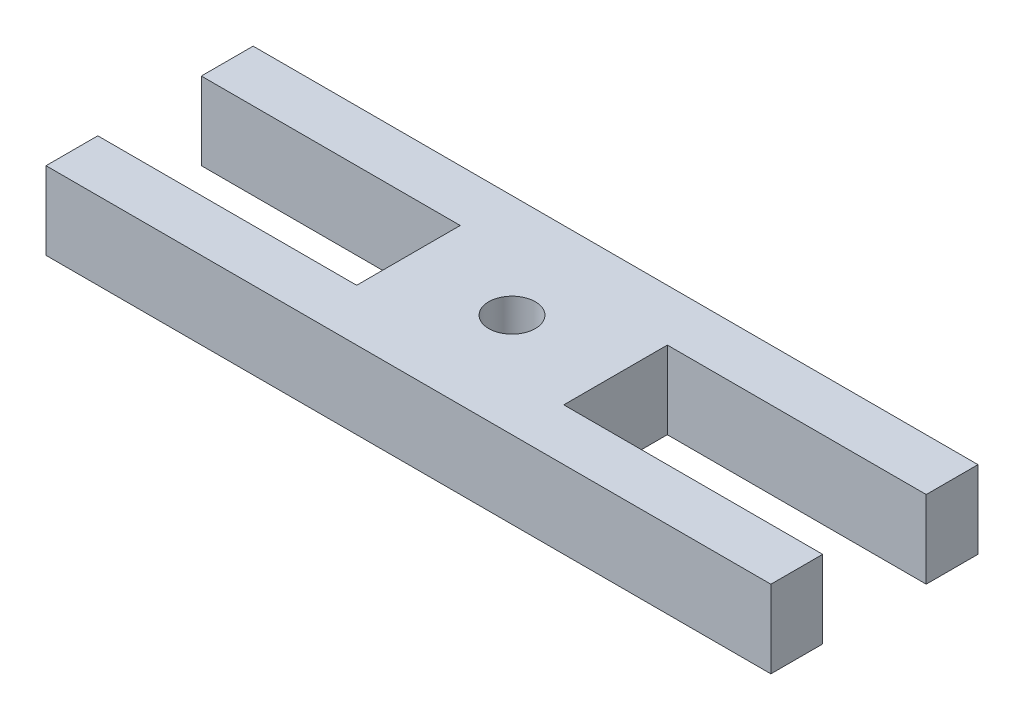
ISO-10303-21;
HEADER;
FILE_DESCRIPTION(('STEP AP214'),'2;1');
FILE_NAME('part.step','',(''),(''),'','','');
FILE_SCHEMA(('AUTOMOTIVE_DESIGN { 1 0 10303 214 1 1 1 1 }'));
ENDSEC;
DATA;
#1=APPLICATION_CONTEXT('core data for automotive mechanical design processes');
#2=APPLICATION_PROTOCOL_DEFINITION('international standard','automotive_design',2000,#1);
#3=PRODUCT_CONTEXT('',#1,'mechanical');
#4=PRODUCT('Part','Part','',(#3));
#5=PRODUCT_RELATED_PRODUCT_CATEGORY('part','',(#4));
#6=PRODUCT_DEFINITION_FORMATION('','',#4);
#7=PRODUCT_DEFINITION_CONTEXT('part definition',#1,'design');
#8=PRODUCT_DEFINITION('design','',#6,#7);
#9=PRODUCT_DEFINITION_SHAPE('','',#8);
#10=(LENGTH_UNIT() NAMED_UNIT(*) SI_UNIT(.MILLI.,.METRE.));
#11=(NAMED_UNIT(*) PLANE_ANGLE_UNIT() SI_UNIT($,.RADIAN.));
#12=(NAMED_UNIT(*) SI_UNIT($,.STERADIAN.) SOLID_ANGLE_UNIT());
#13=UNCERTAINTY_MEASURE_WITH_UNIT(LENGTH_MEASURE(1.E-05),#10,'distance_accuracy_value','');
#14=(GEOMETRIC_REPRESENTATION_CONTEXT(3) GLOBAL_UNCERTAINTY_ASSIGNED_CONTEXT((#13)) GLOBAL_UNIT_ASSIGNED_CONTEXT((#10,
#11,#12)) REPRESENTATION_CONTEXT('',''));
#15=CARTESIAN_POINT('',(0.,0.,0.));
#16=DIRECTION('',(0.,0.,1.));
#17=DIRECTION('',(1.,0.,0.));
#18=AXIS2_PLACEMENT_3D('',#15,#16,#17);
#19=CARTESIAN_POINT('',(-34.5830738893269,1.5,0.));
#20=DIRECTION('',(-1.,0.,0.));
#21=DIRECTION('',(0.,0.,1.));
#22=AXIS2_PLACEMENT_3D('',#19,#20,#21);
#23=PLANE('',#22);
#24=DIRECTION('',(0.,0.,-1.));
#25=VECTOR('',#24,1.);
#26=CARTESIAN_POINT('',(-34.5830738893269,0.,0.));
#27=LINE('',#26,#25);
#28=CARTESIAN_POINT('',(-34.5830738893269,0.,-22.4061702796662));
#29=VERTEX_POINT('',#28);
#30=CARTESIAN_POINT('',(-34.5830738893269,0.,-23.4061702796662));
#31=VERTEX_POINT('',#30);
#32=EDGE_CURVE('E157',#29,#31,#27,.T.);
#33=ORIENTED_EDGE('',*,*,#32,.F.);
#34=DIRECTION('',(0.,-1.,0.));
#35=VECTOR('',#34,1.);
#36=CARTESIAN_POINT('',(-34.5830738893269,1.5,-22.4061702796662));
#37=LINE('',#36,#35);
#38=CARTESIAN_POINT('',(-34.5830738893269,1.5,-22.4061702796662));
#39=VERTEX_POINT('',#38);
#40=EDGE_CURVE('E11',#39,#29,#37,.T.);
#41=ORIENTED_EDGE('',*,*,#40,.F.);
#42=DIRECTION('',(0.,0.,-1.));
#43=VECTOR('',#42,1.);
#44=CARTESIAN_POINT('',(-34.5830738893269,1.5,0.));
#45=LINE('',#44,#43);
#46=CARTESIAN_POINT('',(-34.5830738893269,1.5,-23.4061702796662));
#47=VERTEX_POINT('',#46);
#48=EDGE_CURVE('E231',#39,#47,#45,.T.);
#49=ORIENTED_EDGE('',*,*,#48,.T.);
#50=DIRECTION('',(0.,-1.,0.));
#51=VECTOR('',#50,1.);
#52=CARTESIAN_POINT('',(-34.5830738893269,1.5,-23.4061702796662));
#53=LINE('',#52,#51);
#54=EDGE_CURVE('E54',#47,#31,#53,.T.);
#55=ORIENTED_EDGE('',*,*,#54,.T.);
#56=EDGE_LOOP('',(#33,#41,#49,#55));
#57=FACE_BOUND('',#56,.T.);
#58=ADVANCED_FACE('F37',(#57),#23,.T.);
#59=CARTESIAN_POINT('',(0.,1.5,-22.4061702796662));
#60=DIRECTION('',(0.,0.,1.));
#61=DIRECTION('',(1.,0.,0.));
#62=AXIS2_PLACEMENT_3D('',#59,#60,#61);
#63=PLANE('',#62);
#64=DIRECTION('',(-1.,0.,0.));
#65=VECTOR('',#64,1.);
#66=CARTESIAN_POINT('',(0.,0.,-22.4061702796662));
#67=LINE('',#66,#65);
#68=CARTESIAN_POINT('',(-20.5830738893269,0.,-22.4061702796662));
#69=VERTEX_POINT('',#68);
#70=EDGE_CURVE('E159',#69,#29,#67,.T.);
#71=ORIENTED_EDGE('',*,*,#70,.F.);
#72=DIRECTION('',(0.,-1.,0.));
#73=VECTOR('',#72,1.);
#74=CARTESIAN_POINT('',(-20.5830738893269,1.5,-22.4061702796662));
#75=LINE('',#74,#73);
#76=CARTESIAN_POINT('',(-20.5830738893269,1.5,-22.4061702796662));
#77=VERTEX_POINT('',#76);
#78=EDGE_CURVE('E46',#77,#69,#75,.T.);
#79=ORIENTED_EDGE('',*,*,#78,.F.);
#80=DIRECTION('',(-1.,0.,0.));
#81=VECTOR('',#80,1.);
#82=CARTESIAN_POINT('',(0.,1.5,-22.4061702796662));
#83=LINE('',#82,#81);
#84=EDGE_CURVE('E227',#77,#39,#83,.T.);
#85=ORIENTED_EDGE('',*,*,#84,.T.);
#86=ORIENTED_EDGE('',*,*,#40,.T.);
#87=EDGE_LOOP('',(#71,#79,#85,#86));
#88=FACE_BOUND('',#87,.T.);
#89=ADVANCED_FACE('F215',(#88),#63,.T.);
#90=CARTESIAN_POINT('',(-20.5830738893269,1.5,0.));
#91=DIRECTION('',(1.,0.,0.));
#92=DIRECTION('',(0.,0.,-1.));
#93=AXIS2_PLACEMENT_3D('',#90,#91,#92);
#94=PLANE('',#93);
#95=DIRECTION('',(0.,0.,1.));
#96=VECTOR('',#95,1.);
#97=CARTESIAN_POINT('',(-20.5830738893269,0.,0.));
#98=LINE('',#97,#96);
#99=CARTESIAN_POINT('',(-20.5830738893269,0.,-23.4061702796662));
#100=VERTEX_POINT('',#99);
#101=EDGE_CURVE('E162',#100,#69,#98,.T.);
#102=ORIENTED_EDGE('',*,*,#101,.F.);
#103=DIRECTION('',(0.,-1.,0.));
#104=VECTOR('',#103,1.);
#105=CARTESIAN_POINT('',(-20.5830738893269,1.5,-23.4061702796662));
#106=LINE('',#105,#104);
#107=CARTESIAN_POINT('',(-20.5830738893269,1.5,-23.4061702796662));
#108=VERTEX_POINT('',#107);
#109=EDGE_CURVE('E204',#108,#100,#106,.T.);
#110=ORIENTED_EDGE('',*,*,#109,.F.);
#111=DIRECTION('',(0.,0.,1.));
#112=VECTOR('',#111,1.);
#113=CARTESIAN_POINT('',(-20.5830738893269,1.5,0.));
#114=LINE('',#113,#112);
#115=EDGE_CURVE('E211',#108,#77,#114,.T.);
#116=ORIENTED_EDGE('',*,*,#115,.T.);
#117=ORIENTED_EDGE('',*,*,#78,.T.);
#118=EDGE_LOOP('',(#102,#110,#116,#117));
#119=FACE_BOUND('',#118,.T.);
#120=ADVANCED_FACE('F209',(#119),#94,.T.);
#121=CARTESIAN_POINT('',(0.,1.5,-23.4061702796662));
#122=DIRECTION('',(0.,0.,-1.));
#123=DIRECTION('',(-1.,0.,0.));
#124=AXIS2_PLACEMENT_3D('',#121,#122,#123);
#125=PLANE('',#124);
#126=DIRECTION('',(1.,0.,0.));
#127=VECTOR('',#126,1.);
#128=CARTESIAN_POINT('',(0.,0.,-23.4061702796662));
#129=LINE('',#128,#127);
#130=CARTESIAN_POINT('',(-25.5830738893269,0.,-23.4061702796662));
#131=VERTEX_POINT('',#130);
#132=EDGE_CURVE('E165',#131,#100,#129,.T.);
#133=ORIENTED_EDGE('',*,*,#132,.F.);
#134=DIRECTION('',(0.,-1.,0.));
#135=VECTOR('',#134,1.);
#136=CARTESIAN_POINT('',(-25.5830738893269,1.5,-23.4061702796662));
#137=LINE('',#136,#135);
#138=CARTESIAN_POINT('',(-25.5830738893269,1.5,-23.4061702796662));
#139=VERTEX_POINT('',#138);
#140=EDGE_CURVE('E202',#139,#131,#137,.T.);
#141=ORIENTED_EDGE('',*,*,#140,.F.);
#142=DIRECTION('',(1.,0.,0.));
#143=VECTOR('',#142,1.);
#144=CARTESIAN_POINT('',(0.,1.5,-23.4061702796662));
#145=LINE('',#144,#143);
#146=EDGE_CURVE('E224',#139,#108,#145,.T.);
#147=ORIENTED_EDGE('',*,*,#146,.T.);
#148=ORIENTED_EDGE('',*,*,#109,.T.);
#149=EDGE_LOOP('',(#133,#141,#147,#148));
#150=FACE_BOUND('',#149,.T.);
#151=ADVANCED_FACE('F221',(#150),#125,.T.);
#152=CARTESIAN_POINT('',(-25.5830738893269,1.5,0.));
#153=DIRECTION('',(1.,0.,0.));
#154=DIRECTION('',(0.,0.,-1.));
#155=AXIS2_PLACEMENT_3D('',#152,#153,#154);
#156=PLANE('',#155);
#157=DIRECTION('',(0.,0.,1.));
#158=VECTOR('',#157,1.);
#159=CARTESIAN_POINT('',(-25.5830738893269,0.,0.));
#160=LINE('',#159,#158);
#161=CARTESIAN_POINT('',(-25.5830738893269,0.,-25.4061702796662));
#162=VERTEX_POINT('',#161);
#163=EDGE_CURVE('E168',#162,#131,#160,.T.);
#164=ORIENTED_EDGE('',*,*,#163,.F.);
#165=DIRECTION('',(0.,-1.,0.));
#166=VECTOR('',#165,1.);
#167=CARTESIAN_POINT('',(-25.5830738893269,1.5,-25.4061702796662));
#168=LINE('',#167,#166);
#169=CARTESIAN_POINT('',(-25.5830738893269,1.5,-25.4061702796662));
#170=VERTEX_POINT('',#169);
#171=EDGE_CURVE('E200',#170,#162,#168,.T.);
#172=ORIENTED_EDGE('',*,*,#171,.F.);
#173=DIRECTION('',(0.,0.,1.));
#174=VECTOR('',#173,1.);
#175=CARTESIAN_POINT('',(-25.5830738893269,1.5,0.));
#176=LINE('',#175,#174);
#177=EDGE_CURVE('E229',#170,#139,#176,.T.);
#178=ORIENTED_EDGE('',*,*,#177,.T.);
#179=ORIENTED_EDGE('',*,*,#140,.T.);
#180=EDGE_LOOP('',(#164,#172,#178,#179));
#181=FACE_BOUND('',#180,.T.);
#182=ADVANCED_FACE('F269',(#181),#156,.T.);
#183=CARTESIAN_POINT('',(0.,1.5,-25.4061702796662));
#184=DIRECTION('',(0.,0.,1.));
#185=DIRECTION('',(1.,0.,0.));
#186=AXIS2_PLACEMENT_3D('',#183,#184,#185);
#187=PLANE('',#186);
#188=DIRECTION('',(-1.,0.,0.));
#189=VECTOR('',#188,1.);
#190=CARTESIAN_POINT('',(0.,0.,-25.4061702796662));
#191=LINE('',#190,#189);
#192=CARTESIAN_POINT('',(-20.5830738893269,0.,-25.4061702796662));
#193=VERTEX_POINT('',#192);
#194=EDGE_CURVE('E171',#193,#162,#191,.T.);
#195=ORIENTED_EDGE('',*,*,#194,.F.);
#196=DIRECTION('',(0.,-1.,0.));
#197=VECTOR('',#196,1.);
#198=CARTESIAN_POINT('',(-20.5830738893269,1.5,-25.4061702796662));
#199=LINE('',#198,#197);
#200=CARTESIAN_POINT('',(-20.5830738893269,1.5,-25.4061702796662));
#201=VERTEX_POINT('',#200);
#202=EDGE_CURVE('E198',#201,#193,#199,.T.);
#203=ORIENTED_EDGE('',*,*,#202,.F.);
#204=DIRECTION('',(-1.,0.,0.));
#205=VECTOR('',#204,1.);
#206=CARTESIAN_POINT('',(0.,1.5,-25.4061702796662));
#207=LINE('',#206,#205);
#208=EDGE_CURVE('E236',#201,#170,#207,.T.);
#209=ORIENTED_EDGE('',*,*,#208,.T.);
#210=ORIENTED_EDGE('',*,*,#171,.T.);
#211=EDGE_LOOP('',(#195,#203,#209,#210));
#212=FACE_BOUND('',#211,.T.);
#213=ADVANCED_FACE('F272',(#212),#187,.T.);
#214=CARTESIAN_POINT('',(-20.5830738893269,1.5,0.));
#215=DIRECTION('',(-1.,0.,0.));
#216=DIRECTION('',(0.,0.,1.));
#217=AXIS2_PLACEMENT_3D('',#214,#215,#216);
#218=PLANE('',#217);
#219=DIRECTION('',(0.,0.,-1.));
#220=VECTOR('',#219,1.);
#221=CARTESIAN_POINT('',(-20.5830738893269,0.,0.));
#222=LINE('',#221,#220);
#223=CARTESIAN_POINT('',(-20.5830738893269,0.,-26.4061702796662));
#224=VERTEX_POINT('',#223);
#225=EDGE_CURVE('E174',#193,#224,#222,.T.);
#226=ORIENTED_EDGE('',*,*,#225,.T.);
#227=DIRECTION('',(0.,-1.,0.));
#228=VECTOR('',#227,1.);
#229=CARTESIAN_POINT('',(-20.5830738893269,1.5,-26.4061702796662));
#230=LINE('',#229,#228);
#231=CARTESIAN_POINT('',(-20.5830738893269,1.5,-26.4061702796662));
#232=VERTEX_POINT('',#231);
#233=EDGE_CURVE('E195',#232,#224,#230,.T.);
#234=ORIENTED_EDGE('',*,*,#233,.F.);
#235=DIRECTION('',(0.,0.,-1.));
#236=VECTOR('',#235,1.);
#237=CARTESIAN_POINT('',(-20.5830738893269,1.5,0.));
#238=LINE('',#237,#236);
#239=EDGE_CURVE('E239',#201,#232,#238,.T.);
#240=ORIENTED_EDGE('',*,*,#239,.F.);
#241=ORIENTED_EDGE('',*,*,#202,.T.);
#242=EDGE_LOOP('',(#226,#234,#240,#241));
#243=FACE_BOUND('',#242,.T.);
#244=ADVANCED_FACE('F276',(#243),#218,.F.);
#245=CARTESIAN_POINT('',(0.,1.5,-26.4061702796662));
#246=DIRECTION('',(0.,0.,1.));
#247=DIRECTION('',(1.,0.,0.));
#248=AXIS2_PLACEMENT_3D('',#245,#246,#247);
#249=PLANE('',#248);
#250=DIRECTION('',(-1.,0.,0.));
#251=VECTOR('',#250,1.);
#252=CARTESIAN_POINT('',(0.,0.,-26.4061702796662));
#253=LINE('',#252,#251);
#254=CARTESIAN_POINT('',(-34.5830738893269,0.,-26.4061702796662));
#255=VERTEX_POINT('',#254);
#256=EDGE_CURVE('E177',#224,#255,#253,.T.);
#257=ORIENTED_EDGE('',*,*,#256,.T.);
#258=DIRECTION('',(0.,-1.,0.));
#259=VECTOR('',#258,1.);
#260=CARTESIAN_POINT('',(-34.5830738893269,1.5,-26.4061702796662));
#261=LINE('',#260,#259);
#262=CARTESIAN_POINT('',(-34.5830738893269,1.5,-26.4061702796662));
#263=VERTEX_POINT('',#262);
#264=EDGE_CURVE('E193',#263,#255,#261,.T.);
#265=ORIENTED_EDGE('',*,*,#264,.F.);
#266=DIRECTION('',(-1.,0.,0.));
#267=VECTOR('',#266,1.);
#268=CARTESIAN_POINT('',(0.,1.5,-26.4061702796662));
#269=LINE('',#268,#267);
#270=EDGE_CURVE('E242',#232,#263,#269,.T.);
#271=ORIENTED_EDGE('',*,*,#270,.F.);
#272=ORIENTED_EDGE('',*,*,#233,.T.);
#273=EDGE_LOOP('',(#257,#265,#271,#272));
#274=FACE_BOUND('',#273,.T.);
#275=ADVANCED_FACE('F280',(#274),#249,.F.);
#276=CARTESIAN_POINT('',(-34.5830738893269,1.5,0.));
#277=DIRECTION('',(-1.,0.,0.));
#278=DIRECTION('',(0.,0.,1.));
#279=AXIS2_PLACEMENT_3D('',#276,#277,#278);
#280=PLANE('',#279);
#281=DIRECTION('',(0.,0.,-1.));
#282=VECTOR('',#281,1.);
#283=CARTESIAN_POINT('',(-34.5830738893269,0.,0.));
#284=LINE('',#283,#282);
#285=CARTESIAN_POINT('',(-34.5830738893269,0.,-25.4061702796662));
#286=VERTEX_POINT('',#285);
#287=EDGE_CURVE('E180',#286,#255,#284,.T.);
#288=ORIENTED_EDGE('',*,*,#287,.F.);
#289=DIRECTION('',(0.,-1.,0.));
#290=VECTOR('',#289,1.);
#291=CARTESIAN_POINT('',(-34.5830738893269,1.5,-25.4061702796662));
#292=LINE('',#291,#290);
#293=CARTESIAN_POINT('',(-34.5830738893269,1.5,-25.4061702796662));
#294=VERTEX_POINT('',#293);
#295=EDGE_CURVE('E137',#294,#286,#292,.T.);
#296=ORIENTED_EDGE('',*,*,#295,.F.);
#297=DIRECTION('',(0.,0.,-1.));
#298=VECTOR('',#297,1.);
#299=CARTESIAN_POINT('',(-34.5830738893269,1.5,0.));
#300=LINE('',#299,#298);
#301=EDGE_CURVE('E146',#294,#263,#300,.T.);
#302=ORIENTED_EDGE('',*,*,#301,.T.);
#303=ORIENTED_EDGE('',*,*,#264,.T.);
#304=EDGE_LOOP('',(#288,#296,#302,#303));
#305=FACE_BOUND('',#304,.T.);
#306=ADVANCED_FACE('F245',(#305),#280,.T.);
#307=CARTESIAN_POINT('',(0.,1.5,-25.4061702796662));
#308=DIRECTION('',(0.,0.,1.));
#309=DIRECTION('',(1.,0.,0.));
#310=AXIS2_PLACEMENT_3D('',#307,#308,#309);
#311=PLANE('',#310);
#312=DIRECTION('',(-1.,0.,0.));
#313=VECTOR('',#312,1.);
#314=CARTESIAN_POINT('',(0.,0.,-25.4061702796662));
#315=LINE('',#314,#313);
#316=CARTESIAN_POINT('',(-29.5830738893269,0.,-25.4061702796662));
#317=VERTEX_POINT('',#316);
#318=EDGE_CURVE('E133',#317,#286,#315,.T.);
#319=ORIENTED_EDGE('',*,*,#318,.F.);
#320=DIRECTION('',(0.,-1.,0.));
#321=VECTOR('',#320,1.);
#322=CARTESIAN_POINT('',(-29.5830738893269,1.5,-25.4061702796662));
#323=LINE('',#322,#321);
#324=CARTESIAN_POINT('',(-29.5830738893269,1.5,-25.4061702796662));
#325=VERTEX_POINT('',#324);
#326=EDGE_CURVE('E128',#325,#317,#323,.T.);
#327=ORIENTED_EDGE('',*,*,#326,.F.);
#328=DIRECTION('',(-1.,0.,0.));
#329=VECTOR('',#328,1.);
#330=CARTESIAN_POINT('',(0.,1.5,-25.4061702796662));
#331=LINE('',#330,#329);
#332=EDGE_CURVE('E131',#325,#294,#331,.T.);
#333=ORIENTED_EDGE('',*,*,#332,.T.);
#334=ORIENTED_EDGE('',*,*,#295,.T.);
#335=EDGE_LOOP('',(#319,#327,#333,#334));
#336=FACE_BOUND('',#335,.T.);
#337=ADVANCED_FACE('F130',(#336),#311,.T.);
#338=CARTESIAN_POINT('',(-29.5830738893269,1.5,0.));
#339=DIRECTION('',(-1.,0.,0.));
#340=DIRECTION('',(0.,0.,1.));
#341=AXIS2_PLACEMENT_3D('',#338,#339,#340);
#342=PLANE('',#341);
#343=DIRECTION('',(0.,0.,-1.));
#344=VECTOR('',#343,1.);
#345=CARTESIAN_POINT('',(-29.5830738893269,0.,0.));
#346=LINE('',#345,#344);
#347=CARTESIAN_POINT('',(-29.5830738893269,0.,-23.4061702796662));
#348=VERTEX_POINT('',#347);
#349=EDGE_CURVE('E184',#348,#317,#346,.T.);
#350=ORIENTED_EDGE('',*,*,#349,.F.);
#351=DIRECTION('',(0.,-1.,0.));
#352=VECTOR('',#351,1.);
#353=CARTESIAN_POINT('',(-29.5830738893269,1.5,-23.4061702796662));
#354=LINE('',#353,#352);
#355=CARTESIAN_POINT('',(-29.5830738893269,1.5,-23.4061702796662));
#356=VERTEX_POINT('',#355);
#357=EDGE_CURVE('E91',#356,#348,#354,.T.);
#358=ORIENTED_EDGE('',*,*,#357,.F.);
#359=DIRECTION('',(0.,0.,-1.));
#360=VECTOR('',#359,1.);
#361=CARTESIAN_POINT('',(-29.5830738893269,1.5,0.));
#362=LINE('',#361,#360);
#363=EDGE_CURVE('E144',#356,#325,#362,.T.);
#364=ORIENTED_EDGE('',*,*,#363,.T.);
#365=ORIENTED_EDGE('',*,*,#326,.T.);
#366=EDGE_LOOP('',(#350,#358,#364,#365));
#367=FACE_BOUND('',#366,.T.);
#368=ADVANCED_FACE('F148',(#367),#342,.T.);
#369=CARTESIAN_POINT('',(-27.5830738893269,1.5,-24.4061702796662));
#370=DIRECTION('',(0.,-1.,0.));
#371=DIRECTION('',(0.,0.,-1.));
#372=AXIS2_PLACEMENT_3D('',#369,#370,#371);
#373=CYLINDRICAL_SURFACE('',#372,0.449999999999998);
#374=CARTESIAN_POINT('',(-27.5830738893269,1.5,-24.4061702796662));
#375=DIRECTION('',(0.,1.,0.));
#376=DIRECTION('',(0.,0.,1.));
#377=AXIS2_PLACEMENT_3D('',#374,#375,#376);
#378=CIRCLE('',#377,0.449999999999998);
#379=CARTESIAN_POINT('',(-27.5830738893269,1.5,-23.9561702796662));
#380=VERTEX_POINT('',#379);
#381=EDGE_CURVE('E189',#380,#380,#378,.T.);
#382=ORIENTED_EDGE('',*,*,#381,.T.);
#383=EDGE_LOOP('',(#382));
#384=FACE_BOUND('',#383,.T.);
#385=CARTESIAN_POINT('',(-27.5830738893269,0.,-24.4061702796662));
#386=DIRECTION('',(0.,1.,0.));
#387=DIRECTION('',(0.,0.,1.));
#388=AXIS2_PLACEMENT_3D('',#385,#386,#387);
#389=CIRCLE('',#388,0.449999999999998);
#390=CARTESIAN_POINT('',(-27.5830738893269,0.,-23.9561702796662));
#391=VERTEX_POINT('',#390);
#392=EDGE_CURVE('E154',#391,#391,#389,.T.);
#393=ORIENTED_EDGE('',*,*,#392,.F.);
#394=EDGE_LOOP('',(#393));
#395=FACE_BOUND('',#394,.T.);
#396=ADVANCED_FACE('F39',(#384,#395),#373,.F.);
#397=CARTESIAN_POINT('',(0.,1.5,-23.4061702796662));
#398=DIRECTION('',(0.,0.,-1.));
#399=DIRECTION('',(-1.,0.,0.));
#400=AXIS2_PLACEMENT_3D('',#397,#398,#399);
#401=PLANE('',#400);
#402=DIRECTION('',(1.,0.,0.));
#403=VECTOR('',#402,1.);
#404=CARTESIAN_POINT('',(0.,0.,-23.4061702796662));
#405=LINE('',#404,#403);
#406=EDGE_CURVE('E186',#31,#348,#405,.T.);
#407=ORIENTED_EDGE('',*,*,#406,.F.);
#408=ORIENTED_EDGE('',*,*,#54,.F.);
#409=DIRECTION('',(1.,0.,0.));
#410=VECTOR('',#409,1.);
#411=CARTESIAN_POINT('',(0.,1.5,-23.4061702796662));
#412=LINE('',#411,#410);
#413=EDGE_CURVE('E149',#47,#356,#412,.T.);
#414=ORIENTED_EDGE('',*,*,#413,.T.);
#415=ORIENTED_EDGE('',*,*,#357,.T.);
#416=EDGE_LOOP('',(#407,#408,#414,#415));
#417=FACE_BOUND('',#416,.T.);
#418=ADVANCED_FACE('F247',(#417),#401,.T.);
#419=CARTESIAN_POINT('',(0.,1.5,0.));
#420=DIRECTION('',(0.,1.,0.));
#421=DIRECTION('',(0.,0.,1.));
#422=AXIS2_PLACEMENT_3D('',#419,#420,#421);
#423=PLANE('',#422);
#424=ORIENTED_EDGE('',*,*,#381,.F.);
#425=EDGE_LOOP('',(#424));
#426=FACE_BOUND('',#425,.T.);
#427=ORIENTED_EDGE('',*,*,#48,.F.);
#428=ORIENTED_EDGE('',*,*,#84,.F.);
#429=ORIENTED_EDGE('',*,*,#115,.F.);
#430=ORIENTED_EDGE('',*,*,#146,.F.);
#431=ORIENTED_EDGE('',*,*,#177,.F.);
#432=ORIENTED_EDGE('',*,*,#208,.F.);
#433=ORIENTED_EDGE('',*,*,#239,.T.);
#434=ORIENTED_EDGE('',*,*,#270,.T.);
#435=ORIENTED_EDGE('',*,*,#301,.F.);
#436=ORIENTED_EDGE('',*,*,#332,.F.);
#437=ORIENTED_EDGE('',*,*,#363,.F.);
#438=ORIENTED_EDGE('',*,*,#413,.F.);
#439=EDGE_LOOP('',(#427,#428,#429,#430,#431,#432,#433,#434,#435,#436,#437,#438));
#440=FACE_BOUND('',#439,.T.);
#441=ADVANCED_FACE('F142',(#426,#440),#423,.T.);
#442=CARTESIAN_POINT('',(0.,0.,0.));
#443=DIRECTION('',(0.,1.,0.));
#444=DIRECTION('',(0.,0.,1.));
#445=AXIS2_PLACEMENT_3D('',#442,#443,#444);
#446=PLANE('',#445);
#447=ORIENTED_EDGE('',*,*,#392,.T.);
#448=EDGE_LOOP('',(#447));
#449=FACE_BOUND('',#448,.T.);
#450=ORIENTED_EDGE('',*,*,#32,.T.);
#451=ORIENTED_EDGE('',*,*,#406,.T.);
#452=ORIENTED_EDGE('',*,*,#349,.T.);
#453=ORIENTED_EDGE('',*,*,#318,.T.);
#454=ORIENTED_EDGE('',*,*,#287,.T.);
#455=ORIENTED_EDGE('',*,*,#256,.F.);
#456=ORIENTED_EDGE('',*,*,#225,.F.);
#457=ORIENTED_EDGE('',*,*,#194,.T.);
#458=ORIENTED_EDGE('',*,*,#163,.T.);
#459=ORIENTED_EDGE('',*,*,#132,.T.);
#460=ORIENTED_EDGE('',*,*,#101,.T.);
#461=ORIENTED_EDGE('',*,*,#70,.T.);
#462=EDGE_LOOP('',(#450,#451,#452,#453,#454,#455,#456,#457,#458,#459,#460,#461));
#463=FACE_BOUND('',#462,.T.);
#464=ADVANCED_FACE('F217',(#449,#463),#446,.F.);
#465=CLOSED_SHELL('',(#58,#89,#120,#151,#182,#213,#244,#275,#306,#337,#368,#396,#418,#441,#464));
#466=MANIFOLD_SOLID_BREP('B2',#465);
#467=ADVANCED_BREP_SHAPE_REPRESENTATION('',(#18,#466),#14);
#468=SHAPE_DEFINITION_REPRESENTATION(#9,#467);
ENDSEC;
END-ISO-10303-21;
